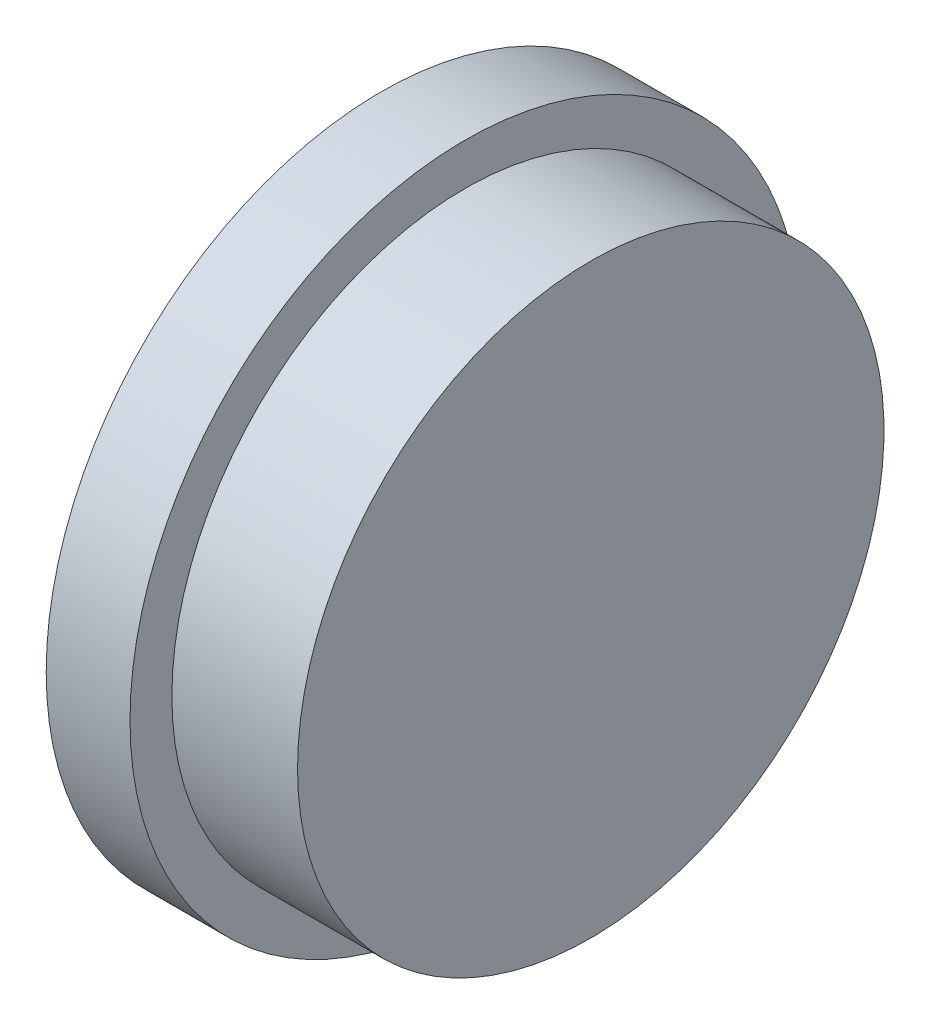
ISO-10303-21;
HEADER;
FILE_DESCRIPTION(('STEP AP214'),'2;1');
FILE_NAME('part.step','',(''),(''),'','','');
FILE_SCHEMA(('AUTOMOTIVE_DESIGN { 1 0 10303 214 1 1 1 1 }'));
ENDSEC;
DATA;
#1=APPLICATION_CONTEXT('core data for automotive mechanical design processes');
#2=APPLICATION_PROTOCOL_DEFINITION('international standard','automotive_design',2000,#1);
#3=PRODUCT_CONTEXT('',#1,'mechanical');
#4=PRODUCT('Part','Part','',(#3));
#5=PRODUCT_RELATED_PRODUCT_CATEGORY('part','',(#4));
#6=PRODUCT_DEFINITION_FORMATION('','',#4);
#7=PRODUCT_DEFINITION_CONTEXT('part definition',#1,'design');
#8=PRODUCT_DEFINITION('design','',#6,#7);
#9=PRODUCT_DEFINITION_SHAPE('','',#8);
#10=(LENGTH_UNIT() NAMED_UNIT(*) SI_UNIT(.MILLI.,.METRE.));
#11=(NAMED_UNIT(*) PLANE_ANGLE_UNIT() SI_UNIT($,.RADIAN.));
#12=(NAMED_UNIT(*) SI_UNIT($,.STERADIAN.) SOLID_ANGLE_UNIT());
#13=UNCERTAINTY_MEASURE_WITH_UNIT(LENGTH_MEASURE(1.E-05),#10,'distance_accuracy_value','');
#14=(GEOMETRIC_REPRESENTATION_CONTEXT(3) GLOBAL_UNCERTAINTY_ASSIGNED_CONTEXT((#13)) GLOBAL_UNIT_ASSIGNED_CONTEXT((#10,
#11,#12)) REPRESENTATION_CONTEXT('',''));
#15=CARTESIAN_POINT('',(0.,0.,0.));
#16=DIRECTION('',(0.,0.,1.));
#17=DIRECTION('',(1.,0.,0.));
#18=AXIS2_PLACEMENT_3D('',#15,#16,#17);
#19=CARTESIAN_POINT('',(150.,0.,0.));
#20=DIRECTION('',(-1.,0.,0.));
#21=DIRECTION('',(0.,0.,1.));
#22=AXIS2_PLACEMENT_3D('',#19,#20,#21);
#23=PLANE('',#22);
#24=CARTESIAN_POINT('',(150.,0.,0.));
#25=DIRECTION('',(-1.,0.,0.));
#26=DIRECTION('',(0.,0.,1.));
#27=AXIS2_PLACEMENT_3D('',#24,#25,#26);
#28=CIRCLE('',#27,210.);
#29=CARTESIAN_POINT('',(150.,0.,210.));
#30=VERTEX_POINT('',#29);
#31=EDGE_CURVE('E10',#30,#30,#28,.T.);
#32=ORIENTED_EDGE('',*,*,#31,.F.);
#33=EDGE_LOOP('',(#32));
#34=FACE_BOUND('',#33,.T.);
#35=ADVANCED_FACE('F37',(#34),#23,.F.);
#36=CARTESIAN_POINT('',(0.,0.,0.));
#37=DIRECTION('',(-1.,0.,0.));
#38=DIRECTION('',(0.,0.,1.));
#39=AXIS2_PLACEMENT_3D('',#36,#37,#38);
#40=CYLINDRICAL_SURFACE('',#39,210.);
#41=CARTESIAN_POINT('',(60.,0.,0.));
#42=DIRECTION('',(-1.,0.,0.));
#43=DIRECTION('',(0.,0.,1.));
#44=AXIS2_PLACEMENT_3D('',#41,#42,#43);
#45=CIRCLE('',#44,210.);
#46=CARTESIAN_POINT('',(60.,0.,210.));
#47=VERTEX_POINT('',#46);
#48=EDGE_CURVE('E44',#47,#47,#45,.T.);
#49=ORIENTED_EDGE('',*,*,#48,.F.);
#50=EDGE_LOOP('',(#49));
#51=FACE_BOUND('',#50,.T.);
#52=ORIENTED_EDGE('',*,*,#31,.T.);
#53=EDGE_LOOP('',(#52));
#54=FACE_BOUND('',#53,.T.);
#55=ADVANCED_FACE('F91',(#51,#54),#40,.T.);
#56=CARTESIAN_POINT('',(60.,210.,0.));
#57=DIRECTION('',(-1.,0.,0.));
#58=DIRECTION('',(0.,0.,1.));
#59=AXIS2_PLACEMENT_3D('',#56,#57,#58);
#60=PLANE('',#59);
#61=CARTESIAN_POINT('',(60.,0.,0.));
#62=DIRECTION('',(-1.,0.,0.));
#63=DIRECTION('',(0.,0.,1.));
#64=AXIS2_PLACEMENT_3D('',#61,#62,#63);
#65=CIRCLE('',#64,240.);
#66=CARTESIAN_POINT('',(60.,0.,240.));
#67=VERTEX_POINT('',#66);
#68=EDGE_CURVE('E49',#67,#67,#65,.T.);
#69=ORIENTED_EDGE('',*,*,#68,.F.);
#70=EDGE_LOOP('',(#69));
#71=FACE_BOUND('',#70,.T.);
#72=ORIENTED_EDGE('',*,*,#48,.T.);
#73=EDGE_LOOP('',(#72));
#74=FACE_BOUND('',#73,.T.);
#75=ADVANCED_FACE('F86',(#71,#74),#60,.F.);
#76=CARTESIAN_POINT('',(0.,0.,0.));
#77=DIRECTION('',(-1.,0.,0.));
#78=DIRECTION('',(0.,0.,1.));
#79=AXIS2_PLACEMENT_3D('',#76,#77,#78);
#80=CYLINDRICAL_SURFACE('',#79,240.);
#81=CARTESIAN_POINT('',(0.,0.,0.));
#82=DIRECTION('',(-1.,0.,0.));
#83=DIRECTION('',(0.,0.,1.));
#84=AXIS2_PLACEMENT_3D('',#81,#82,#83);
#85=CIRCLE('',#84,240.);
#86=CARTESIAN_POINT('',(0.,0.,240.));
#87=VERTEX_POINT('',#86);
#88=EDGE_CURVE('E54',#87,#87,#85,.T.);
#89=ORIENTED_EDGE('',*,*,#88,.F.);
#90=EDGE_LOOP('',(#89));
#91=FACE_BOUND('',#90,.T.);
#92=ORIENTED_EDGE('',*,*,#68,.T.);
#93=EDGE_LOOP('',(#92));
#94=FACE_BOUND('',#93,.T.);
#95=ADVANCED_FACE('F80',(#91,#94),#80,.T.);
#96=CARTESIAN_POINT('',(0.,240.,0.));
#97=DIRECTION('',(1.,0.,0.));
#98=DIRECTION('',(0.,0.,-1.));
#99=AXIS2_PLACEMENT_3D('',#96,#97,#98);
#100=PLANE('',#99);
#101=CARTESIAN_POINT('',(0.,0.,0.));
#102=DIRECTION('',(-1.,0.,0.));
#103=DIRECTION('',(0.,0.,1.));
#104=AXIS2_PLACEMENT_3D('',#101,#102,#103);
#105=CIRCLE('',#104,160.);
#106=CARTESIAN_POINT('',(0.,0.,160.));
#107=VERTEX_POINT('',#106);
#108=EDGE_CURVE('E60',#107,#107,#105,.T.);
#109=ORIENTED_EDGE('',*,*,#108,.F.);
#110=EDGE_LOOP('',(#109));
#111=FACE_BOUND('',#110,.T.);
#112=ORIENTED_EDGE('',*,*,#88,.T.);
#113=EDGE_LOOP('',(#112));
#114=FACE_BOUND('',#113,.T.);
#115=ADVANCED_FACE('F74',(#111,#114),#100,.F.);
#116=CARTESIAN_POINT('',(0.,0.,0.));
#117=DIRECTION('',(-1.,0.,0.));
#118=DIRECTION('',(0.,0.,1.));
#119=AXIS2_PLACEMENT_3D('',#116,#117,#118);
#120=CYLINDRICAL_SURFACE('',#119,160.);
#121=CARTESIAN_POINT('',(130.,0.,0.));
#122=DIRECTION('',(-1.,0.,0.));
#123=DIRECTION('',(0.,0.,1.));
#124=AXIS2_PLACEMENT_3D('',#121,#122,#123);
#125=CIRCLE('',#124,160.);
#126=CARTESIAN_POINT('',(130.,0.,160.));
#127=VERTEX_POINT('',#126);
#128=EDGE_CURVE('E64',#127,#127,#125,.T.);
#129=ORIENTED_EDGE('',*,*,#128,.F.);
#130=EDGE_LOOP('',(#129));
#131=FACE_BOUND('',#130,.T.);
#132=ORIENTED_EDGE('',*,*,#108,.T.);
#133=EDGE_LOOP('',(#132));
#134=FACE_BOUND('',#133,.T.);
#135=ADVANCED_FACE('F71',(#131,#134),#120,.F.);
#136=CARTESIAN_POINT('',(130.,160.,0.));
#137=DIRECTION('',(1.,0.,0.));
#138=DIRECTION('',(0.,0.,-1.));
#139=AXIS2_PLACEMENT_3D('',#136,#137,#138);
#140=PLANE('',#139);
#141=ORIENTED_EDGE('',*,*,#128,.T.);
#142=EDGE_LOOP('',(#141));
#143=FACE_BOUND('',#142,.T.);
#144=ADVANCED_FACE('F69',(#143),#140,.F.);
#145=CLOSED_SHELL('',(#35,#55,#75,#95,#115,#135,#144));
#146=MANIFOLD_SOLID_BREP('B2',#145);
#147=ADVANCED_BREP_SHAPE_REPRESENTATION('',(#18,#146),#14);
#148=SHAPE_DEFINITION_REPRESENTATION(#9,#147);
ENDSEC;
END-ISO-10303-21;
